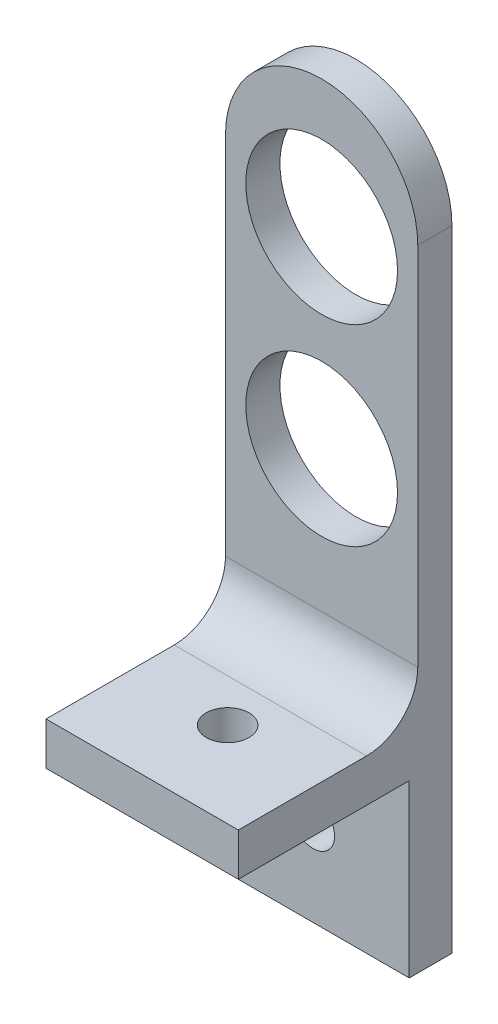
ISO-10303-21;
HEADER;
FILE_DESCRIPTION(('STEP AP214'),'2;1');
FILE_NAME('part.step','',(''),(''),'','','');
FILE_SCHEMA(('AUTOMOTIVE_DESIGN { 1 0 10303 214 1 1 1 1 }'));
ENDSEC;
DATA;
#1=APPLICATION_CONTEXT('core data for automotive mechanical design processes');
#2=APPLICATION_PROTOCOL_DEFINITION('international standard','automotive_design',2000,#1);
#3=PRODUCT_CONTEXT('',#1,'mechanical');
#4=PRODUCT('Part','Part','',(#3));
#5=PRODUCT_RELATED_PRODUCT_CATEGORY('part','',(#4));
#6=PRODUCT_DEFINITION_FORMATION('','',#4);
#7=PRODUCT_DEFINITION_CONTEXT('part definition',#1,'design');
#8=PRODUCT_DEFINITION('design','',#6,#7);
#9=PRODUCT_DEFINITION_SHAPE('','',#8);
#10=(LENGTH_UNIT() NAMED_UNIT(*) SI_UNIT(.MILLI.,.METRE.));
#11=(NAMED_UNIT(*) PLANE_ANGLE_UNIT() SI_UNIT($,.RADIAN.));
#12=(NAMED_UNIT(*) SI_UNIT($,.STERADIAN.) SOLID_ANGLE_UNIT());
#13=UNCERTAINTY_MEASURE_WITH_UNIT(LENGTH_MEASURE(1.E-05),#10,'distance_accuracy_value','');
#14=(GEOMETRIC_REPRESENTATION_CONTEXT(3) GLOBAL_UNCERTAINTY_ASSIGNED_CONTEXT((#13)) GLOBAL_UNIT_ASSIGNED_CONTEXT((#10,
#11,#12)) REPRESENTATION_CONTEXT('',''));
#15=CARTESIAN_POINT('',(0.,0.,0.));
#16=DIRECTION('',(0.,0.,1.));
#17=DIRECTION('',(1.,0.,0.));
#18=AXIS2_PLACEMENT_3D('',#15,#16,#17);
#19=CARTESIAN_POINT('',(0.,39.6875,5.08));
#20=DIRECTION('',(0.,0.,-1.));
#21=DIRECTION('',(-1.,0.,0.));
#22=AXIS2_PLACEMENT_3D('',#19,#20,#21);
#23=CYLINDRICAL_SURFACE('',#22,14.2875);
#24=DIRECTION('',(0.,0.,1.));
#25=VECTOR('',#24,1.);
#26=CARTESIAN_POINT('',(-14.2875,39.6875,5.08));
#27=LINE('',#26,#25);
#28=CARTESIAN_POINT('',(-14.2875,39.6875,5.08));
#29=VERTEX_POINT('',#28);
#30=CARTESIAN_POINT('',(-14.2875,39.6875,0.));
#31=VERTEX_POINT('',#30);
#32=EDGE_CURVE('E196',#29,#31,#27,.F.);
#33=ORIENTED_EDGE('',*,*,#32,.F.);
#34=CARTESIAN_POINT('',(0.,39.6875,5.08));
#35=DIRECTION('',(0.,0.,1.));
#36=DIRECTION('',(1.,0.,0.));
#37=AXIS2_PLACEMENT_3D('',#34,#35,#36);
#38=CIRCLE('',#37,14.2875);
#39=CARTESIAN_POINT('',(14.2875,39.6875,5.08));
#40=VERTEX_POINT('',#39);
#41=EDGE_CURVE('E57',#40,#29,#38,.T.);
#42=ORIENTED_EDGE('',*,*,#41,.F.);
#43=DIRECTION('',(0.,0.,-1.));
#44=VECTOR('',#43,1.);
#45=CARTESIAN_POINT('',(14.2875,39.6875,5.08));
#46=LINE('',#45,#44);
#47=CARTESIAN_POINT('',(14.2875,39.6875,0.));
#48=VERTEX_POINT('',#47);
#49=EDGE_CURVE('E205',#48,#40,#46,.F.);
#50=ORIENTED_EDGE('',*,*,#49,.F.);
#51=CARTESIAN_POINT('',(0.,39.6875,0.));
#52=DIRECTION('',(0.,0.,1.));
#53=DIRECTION('',(1.,0.,0.));
#54=AXIS2_PLACEMENT_3D('',#51,#52,#53);
#55=CIRCLE('',#54,14.2875);
#56=EDGE_CURVE('E11',#31,#48,#55,.F.);
#57=ORIENTED_EDGE('',*,*,#56,.F.);
#58=EDGE_LOOP('',(#33,#42,#50,#57));
#59=FACE_BOUND('',#58,.T.);
#60=ADVANCED_FACE('F50',(#59),#23,.T.);
#61=CARTESIAN_POINT('',(-14.2875,0.,5.08));
#62=DIRECTION('',(1.,0.,0.));
#63=DIRECTION('',(0.,1.,0.));
#64=AXIS2_PLACEMENT_3D('',#61,#62,#63);
#65=PLANE('',#64);
#66=DIRECTION('',(0.,-1.,0.));
#67=VECTOR('',#66,1.);
#68=CARTESIAN_POINT('',(-14.2875,0.,5.08));
#69=LINE('',#68,#67);
#70=CARTESIAN_POINT('',(-14.2875,-14.605,5.08));
#71=VERTEX_POINT('',#70);
#72=EDGE_CURVE('E167',#29,#71,#69,.T.);
#73=ORIENTED_EDGE('',*,*,#72,.F.);
#74=ORIENTED_EDGE('',*,*,#32,.T.);
#75=DIRECTION('',(0.,-1.,0.));
#76=VECTOR('',#75,1.);
#77=CARTESIAN_POINT('',(-14.2875,0.,0.));
#78=LINE('',#77,#76);
#79=CARTESIAN_POINT('',(-14.2875,-53.9749999999999,0.));
#80=VERTEX_POINT('',#79);
#81=EDGE_CURVE('E178',#31,#80,#78,.T.);
#82=ORIENTED_EDGE('',*,*,#81,.T.);
#83=DIRECTION('',(0.,0.,-1.));
#84=VECTOR('',#83,1.);
#85=CARTESIAN_POINT('',(-14.2875,-53.9749999999999,6.35));
#86=LINE('',#85,#84);
#87=CARTESIAN_POINT('',(-14.2875,-53.9749999999999,6.35));
#88=VERTEX_POINT('',#87);
#89=EDGE_CURVE('E127',#88,#80,#86,.T.);
#90=ORIENTED_EDGE('',*,*,#89,.F.);
#91=DIRECTION('',(0.,-1.,0.));
#92=VECTOR('',#91,1.);
#93=CARTESIAN_POINT('',(-14.2875,0.,6.35));
#94=LINE('',#93,#92);
#95=CARTESIAN_POINT('',(-14.2875,-28.575,6.35));
#96=VERTEX_POINT('',#95);
#97=EDGE_CURVE('E120',#96,#88,#94,.T.);
#98=ORIENTED_EDGE('',*,*,#97,.F.);
#99=DIRECTION('',(0.,0.,-1.));
#100=VECTOR('',#99,1.);
#101=CARTESIAN_POINT('',(-14.2875,-28.575,31.75));
#102=LINE('',#101,#100);
#103=CARTESIAN_POINT('',(-14.2875,-28.575,31.75));
#104=VERTEX_POINT('',#103);
#105=EDGE_CURVE('E125',#104,#96,#102,.T.);
#106=ORIENTED_EDGE('',*,*,#105,.F.);
#107=DIRECTION('',(0.,-1.,0.));
#108=VECTOR('',#107,1.);
#109=CARTESIAN_POINT('',(-14.2875,0.,31.75));
#110=LINE('',#109,#108);
#111=CARTESIAN_POINT('',(-14.2875,-22.225,31.75));
#112=VERTEX_POINT('',#111);
#113=EDGE_CURVE('E234',#112,#104,#110,.T.);
#114=ORIENTED_EDGE('',*,*,#113,.F.);
#115=DIRECTION('',(0.,0.,-1.));
#116=VECTOR('',#115,1.);
#117=CARTESIAN_POINT('',(-14.2875,-22.225,31.75));
#118=LINE('',#117,#116);
#119=CARTESIAN_POINT('',(-14.2875,-22.225,12.7));
#120=VERTEX_POINT('',#119);
#121=EDGE_CURVE('E144',#112,#120,#118,.T.);
#122=ORIENTED_EDGE('',*,*,#121,.T.);
#123=CARTESIAN_POINT('',(-14.2875,-14.605,12.7));
#124=DIRECTION('',(1.,0.,0.));
#125=DIRECTION('',(0.,1.,0.));
#126=AXIS2_PLACEMENT_3D('',#123,#124,#125);
#127=CIRCLE('',#126,7.62);
#128=EDGE_CURVE('E191',#120,#71,#127,.T.);
#129=ORIENTED_EDGE('',*,*,#128,.T.);
#130=EDGE_LOOP('',(#73,#74,#82,#90,#98,#106,#114,#122,#129));
#131=FACE_BOUND('',#130,.T.);
#132=ADVANCED_FACE('F119',(#131),#65,.F.);
#133=CARTESIAN_POINT('',(14.2875,0.,5.08));
#134=DIRECTION('',(1.,0.,0.));
#135=DIRECTION('',(0.,1.,0.));
#136=AXIS2_PLACEMENT_3D('',#133,#134,#135);
#137=PLANE('',#136);
#138=DIRECTION('',(0.,-1.,0.));
#139=VECTOR('',#138,1.);
#140=CARTESIAN_POINT('',(14.2875,0.,0.));
#141=LINE('',#140,#139);
#142=CARTESIAN_POINT('',(14.2875,-53.9749999999999,0.));
#143=VERTEX_POINT('',#142);
#144=EDGE_CURVE('E165',#48,#143,#141,.T.);
#145=ORIENTED_EDGE('',*,*,#144,.F.);
#146=ORIENTED_EDGE('',*,*,#49,.T.);
#147=DIRECTION('',(0.,-1.,0.));
#148=VECTOR('',#147,1.);
#149=CARTESIAN_POINT('',(14.2875,0.,5.08));
#150=LINE('',#149,#148);
#151=CARTESIAN_POINT('',(14.2875,-14.605,5.08));
#152=VERTEX_POINT('',#151);
#153=EDGE_CURVE('E166',#40,#152,#150,.T.);
#154=ORIENTED_EDGE('',*,*,#153,.T.);
#155=CARTESIAN_POINT('',(14.2875,-14.605,12.7));
#156=DIRECTION('',(1.,0.,0.));
#157=DIRECTION('',(0.,1.,0.));
#158=AXIS2_PLACEMENT_3D('',#155,#156,#157);
#159=CIRCLE('',#158,7.62);
#160=CARTESIAN_POINT('',(14.2875,-22.225,12.7));
#161=VERTEX_POINT('',#160);
#162=EDGE_CURVE('E192',#152,#161,#159,.F.);
#163=ORIENTED_EDGE('',*,*,#162,.T.);
#164=DIRECTION('',(0.,0.,-1.));
#165=VECTOR('',#164,1.);
#166=CARTESIAN_POINT('',(14.2875,-22.225,31.75));
#167=LINE('',#166,#165);
#168=CARTESIAN_POINT('',(14.2875,-22.225,31.75));
#169=VERTEX_POINT('',#168);
#170=EDGE_CURVE('E153',#169,#161,#167,.T.);
#171=ORIENTED_EDGE('',*,*,#170,.F.);
#172=DIRECTION('',(0.,-1.,0.));
#173=VECTOR('',#172,1.);
#174=CARTESIAN_POINT('',(14.2875,0.,31.75));
#175=LINE('',#174,#173);
#176=CARTESIAN_POINT('',(14.2875,-28.575,31.75));
#177=VERTEX_POINT('',#176);
#178=EDGE_CURVE('E226',#169,#177,#175,.T.);
#179=ORIENTED_EDGE('',*,*,#178,.T.);
#180=DIRECTION('',(0.,0.,-1.));
#181=VECTOR('',#180,1.);
#182=CARTESIAN_POINT('',(14.2875,-28.575,31.75));
#183=LINE('',#182,#181);
#184=CARTESIAN_POINT('',(14.2875,-28.575,6.35));
#185=VERTEX_POINT('',#184);
#186=EDGE_CURVE('E148',#177,#185,#183,.T.);
#187=ORIENTED_EDGE('',*,*,#186,.T.);
#188=DIRECTION('',(0.,-1.,0.));
#189=VECTOR('',#188,1.);
#190=CARTESIAN_POINT('',(14.2875,0.,6.35));
#191=LINE('',#190,#189);
#192=CARTESIAN_POINT('',(14.2875,-53.9749999999999,6.35));
#193=VERTEX_POINT('',#192);
#194=EDGE_CURVE('E134',#185,#193,#191,.T.);
#195=ORIENTED_EDGE('',*,*,#194,.T.);
#196=DIRECTION('',(0.,0.,-1.));
#197=VECTOR('',#196,1.);
#198=CARTESIAN_POINT('',(14.2875,-53.9749999999999,6.35));
#199=LINE('',#198,#197);
#200=EDGE_CURVE('E239',#193,#143,#199,.T.);
#201=ORIENTED_EDGE('',*,*,#200,.T.);
#202=EDGE_LOOP('',(#145,#146,#154,#163,#171,#179,#187,#195,#201));
#203=FACE_BOUND('',#202,.T.);
#204=ADVANCED_FACE('F220',(#203),#137,.T.);
#205=CARTESIAN_POINT('',(0.,6.34999999999999,5.08));
#206=DIRECTION('',(0.,0.,-1.));
#207=DIRECTION('',(-1.,0.,0.));
#208=AXIS2_PLACEMENT_3D('',#205,#206,#207);
#209=CYLINDRICAL_SURFACE('',#208,11.2776);
#210=CARTESIAN_POINT('',(0.,6.34999999999999,5.08));
#211=DIRECTION('',(0.,0.,1.));
#212=DIRECTION('',(1.,0.,0.));
#213=AXIS2_PLACEMENT_3D('',#210,#211,#212);
#214=CIRCLE('',#213,11.2776);
#215=CARTESIAN_POINT('',(11.2776,6.34999999999999,5.08));
#216=VERTEX_POINT('',#215);
#217=EDGE_CURVE('E161',#216,#216,#214,.T.);
#218=ORIENTED_EDGE('',*,*,#217,.T.);
#219=EDGE_LOOP('',(#218));
#220=FACE_BOUND('',#219,.T.);
#221=CARTESIAN_POINT('',(0.,6.34999999999999,0.));
#222=DIRECTION('',(0.,0.,1.));
#223=DIRECTION('',(1.,0.,0.));
#224=AXIS2_PLACEMENT_3D('',#221,#222,#223);
#225=CIRCLE('',#224,11.2776);
#226=CARTESIAN_POINT('',(11.2776,6.34999999999999,0.));
#227=VERTEX_POINT('',#226);
#228=EDGE_CURVE('E177',#227,#227,#225,.T.);
#229=ORIENTED_EDGE('',*,*,#228,.F.);
#230=EDGE_LOOP('',(#229));
#231=FACE_BOUND('',#230,.T.);
#232=ADVANCED_FACE('F295',(#220,#231),#209,.F.);
#233=CARTESIAN_POINT('',(0.,34.925,5.08));
#234=DIRECTION('',(0.,0.,-1.));
#235=DIRECTION('',(-1.,0.,0.));
#236=AXIS2_PLACEMENT_3D('',#233,#234,#235);
#237=CYLINDRICAL_SURFACE('',#236,11.2776);
#238=CARTESIAN_POINT('',(0.,34.925,5.08));
#239=DIRECTION('',(0.,0.,1.));
#240=DIRECTION('',(1.,0.,0.));
#241=AXIS2_PLACEMENT_3D('',#238,#239,#240);
#242=CIRCLE('',#241,11.2776);
#243=CARTESIAN_POINT('',(11.2776,34.925,5.08));
#244=VERTEX_POINT('',#243);
#245=EDGE_CURVE('E160',#244,#244,#242,.T.);
#246=ORIENTED_EDGE('',*,*,#245,.T.);
#247=EDGE_LOOP('',(#246));
#248=FACE_BOUND('',#247,.T.);
#249=CARTESIAN_POINT('',(0.,34.925,0.));
#250=DIRECTION('',(0.,0.,1.));
#251=DIRECTION('',(1.,0.,0.));
#252=AXIS2_PLACEMENT_3D('',#249,#250,#251);
#253=CIRCLE('',#252,11.2776);
#254=CARTESIAN_POINT('',(11.2776,34.925,0.));
#255=VERTEX_POINT('',#254);
#256=EDGE_CURVE('E151',#255,#255,#253,.T.);
#257=ORIENTED_EDGE('',*,*,#256,.F.);
#258=EDGE_LOOP('',(#257));
#259=FACE_BOUND('',#258,.T.);
#260=ADVANCED_FACE('F297',(#248,#259),#237,.F.);
#261=CARTESIAN_POINT('',(0.,0.,5.08));
#262=DIRECTION('',(0.,0.,1.));
#263=DIRECTION('',(1.,0.,0.));
#264=AXIS2_PLACEMENT_3D('',#261,#262,#263);
#265=PLANE('',#264);
#266=ORIENTED_EDGE('',*,*,#245,.F.);
#267=EDGE_LOOP('',(#266));
#268=FACE_BOUND('',#267,.T.);
#269=ORIENTED_EDGE('',*,*,#217,.F.);
#270=EDGE_LOOP('',(#269));
#271=FACE_BOUND('',#270,.T.);
#272=ORIENTED_EDGE('',*,*,#153,.F.);
#273=ORIENTED_EDGE('',*,*,#41,.T.);
#274=ORIENTED_EDGE('',*,*,#72,.T.);
#275=DIRECTION('',(1.,0.,0.));
#276=VECTOR('',#275,1.);
#277=CARTESIAN_POINT('',(14.2875,-14.605,5.08));
#278=LINE('',#277,#276);
#279=EDGE_CURVE('E175',#71,#152,#278,.T.);
#280=ORIENTED_EDGE('',*,*,#279,.T.);
#281=EDGE_LOOP('',(#272,#273,#274,#280));
#282=FACE_BOUND('',#281,.T.);
#283=ADVANCED_FACE('F210',(#268,#271,#282),#265,.T.);
#284=CARTESIAN_POINT('',(0.,0.,0.));
#285=DIRECTION('',(0.,0.,1.));
#286=DIRECTION('',(1.,0.,0.));
#287=AXIS2_PLACEMENT_3D('',#284,#285,#286);
#288=PLANE('',#287);
#289=ORIENTED_EDGE('',*,*,#256,.T.);
#290=EDGE_LOOP('',(#289));
#291=FACE_BOUND('',#290,.T.);
#292=ORIENTED_EDGE('',*,*,#228,.T.);
#293=EDGE_LOOP('',(#292));
#294=FACE_BOUND('',#293,.T.);
#295=ORIENTED_EDGE('',*,*,#81,.F.);
#296=ORIENTED_EDGE('',*,*,#56,.T.);
#297=ORIENTED_EDGE('',*,*,#144,.T.);
#298=DIRECTION('',(1.,0.,0.));
#299=VECTOR('',#298,1.);
#300=CARTESIAN_POINT('',(0.,-53.9749999999999,0.));
#301=LINE('',#300,#299);
#302=EDGE_CURVE('E242',#80,#143,#301,.T.);
#303=ORIENTED_EDGE('',*,*,#302,.F.);
#304=EDGE_LOOP('',(#295,#296,#297,#303));
#305=FACE_BOUND('',#304,.T.);
#306=CARTESIAN_POINT('',(0.,-41.275,0.));
#307=DIRECTION('',(0.,0.,1.));
#308=DIRECTION('',(1.,0.,0.));
#309=AXIS2_PLACEMENT_3D('',#306,#307,#308);
#310=CIRCLE('',#309,3.1877);
#311=CARTESIAN_POINT('',(3.1877,-41.275,0.));
#312=VERTEX_POINT('',#311);
#313=EDGE_CURVE('E249',#312,#312,#310,.T.);
#314=ORIENTED_EDGE('',*,*,#313,.T.);
#315=EDGE_LOOP('',(#314));
#316=FACE_BOUND('',#315,.T.);
#317=ADVANCED_FACE('F278',(#291,#294,#305,#316),#288,.F.);
#318=CARTESIAN_POINT('',(0.,-22.225,31.75));
#319=DIRECTION('',(0.,1.,0.));
#320=DIRECTION('',(0.,0.,1.));
#321=AXIS2_PLACEMENT_3D('',#318,#319,#320);
#322=PLANE('',#321);
#323=CARTESIAN_POINT('',(0.,-22.225,19.05));
#324=DIRECTION('',(0.,1.,0.));
#325=DIRECTION('',(0.,0.,1.));
#326=AXIS2_PLACEMENT_3D('',#323,#324,#325);
#327=CIRCLE('',#326,3.1877);
#328=CARTESIAN_POINT('',(0.,-22.225,22.2377));
#329=VERTEX_POINT('',#328);
#330=EDGE_CURVE('E253',#329,#329,#327,.T.);
#331=ORIENTED_EDGE('',*,*,#330,.F.);
#332=EDGE_LOOP('',(#331));
#333=FACE_BOUND('',#332,.T.);
#334=ORIENTED_EDGE('',*,*,#170,.T.);
#335=DIRECTION('',(1.,0.,0.));
#336=VECTOR('',#335,1.);
#337=CARTESIAN_POINT('',(-14.2875,-22.225,12.7));
#338=LINE('',#337,#336);
#339=EDGE_CURVE('E187',#161,#120,#338,.F.);
#340=ORIENTED_EDGE('',*,*,#339,.T.);
#341=ORIENTED_EDGE('',*,*,#121,.F.);
#342=DIRECTION('',(1.,0.,0.));
#343=VECTOR('',#342,1.);
#344=CARTESIAN_POINT('',(0.,-22.225,31.75));
#345=LINE('',#344,#343);
#346=EDGE_CURVE('E224',#112,#169,#345,.T.);
#347=ORIENTED_EDGE('',*,*,#346,.T.);
#348=EDGE_LOOP('',(#334,#340,#341,#347));
#349=FACE_BOUND('',#348,.T.);
#350=ADVANCED_FACE('F222',(#333,#349),#322,.T.);
#351=CARTESIAN_POINT('',(0.,-28.575,31.75));
#352=DIRECTION('',(0.,1.,0.));
#353=DIRECTION('',(0.,0.,1.));
#354=AXIS2_PLACEMENT_3D('',#351,#352,#353);
#355=PLANE('',#354);
#356=CARTESIAN_POINT('',(0.,-28.575,19.05));
#357=DIRECTION('',(0.,-1.,0.));
#358=DIRECTION('',(0.,0.,-1.));
#359=AXIS2_PLACEMENT_3D('',#356,#357,#358);
#360=CIRCLE('',#359,3.1877);
#361=CARTESIAN_POINT('',(0.,-28.575,15.8623));
#362=VERTEX_POINT('',#361);
#363=EDGE_CURVE('E265',#362,#362,#360,.T.);
#364=ORIENTED_EDGE('',*,*,#363,.F.);
#365=EDGE_LOOP('',(#364));
#366=FACE_BOUND('',#365,.T.);
#367=ORIENTED_EDGE('',*,*,#105,.T.);
#368=DIRECTION('',(1.,0.,0.));
#369=VECTOR('',#368,1.);
#370=CARTESIAN_POINT('',(0.,-28.575,6.35));
#371=LINE('',#370,#369);
#372=EDGE_CURVE('E128',#96,#185,#371,.T.);
#373=ORIENTED_EDGE('',*,*,#372,.T.);
#374=ORIENTED_EDGE('',*,*,#186,.F.);
#375=DIRECTION('',(1.,0.,0.));
#376=VECTOR('',#375,1.);
#377=CARTESIAN_POINT('',(0.,-28.575,31.75));
#378=LINE('',#377,#376);
#379=EDGE_CURVE('E141',#104,#177,#378,.T.);
#380=ORIENTED_EDGE('',*,*,#379,.F.);
#381=EDGE_LOOP('',(#367,#373,#374,#380));
#382=FACE_BOUND('',#381,.T.);
#383=ADVANCED_FACE('F142',(#366,#382),#355,.F.);
#384=CARTESIAN_POINT('',(0.,0.,31.75));
#385=DIRECTION('',(0.,0.,1.));
#386=DIRECTION('',(1.,0.,0.));
#387=AXIS2_PLACEMENT_3D('',#384,#385,#386);
#388=PLANE('',#387);
#389=ORIENTED_EDGE('',*,*,#346,.F.);
#390=ORIENTED_EDGE('',*,*,#113,.T.);
#391=ORIENTED_EDGE('',*,*,#379,.T.);
#392=ORIENTED_EDGE('',*,*,#178,.F.);
#393=EDGE_LOOP('',(#389,#390,#391,#392));
#394=FACE_BOUND('',#393,.T.);
#395=ADVANCED_FACE('F269',(#394),#388,.T.);
#396=CARTESIAN_POINT('',(0.,-53.9749999999999,6.35));
#397=DIRECTION('',(0.,1.,0.));
#398=DIRECTION('',(0.,0.,1.));
#399=AXIS2_PLACEMENT_3D('',#396,#397,#398);
#400=PLANE('',#399);
#401=ORIENTED_EDGE('',*,*,#302,.T.);
#402=ORIENTED_EDGE('',*,*,#200,.F.);
#403=DIRECTION('',(1.,0.,0.));
#404=VECTOR('',#403,1.);
#405=CARTESIAN_POINT('',(0.,-53.9749999999999,6.35));
#406=LINE('',#405,#404);
#407=EDGE_CURVE('E129',#88,#193,#406,.T.);
#408=ORIENTED_EDGE('',*,*,#407,.F.);
#409=ORIENTED_EDGE('',*,*,#89,.T.);
#410=EDGE_LOOP('',(#401,#402,#408,#409));
#411=FACE_BOUND('',#410,.T.);
#412=ADVANCED_FACE('F280',(#411),#400,.F.);
#413=CARTESIAN_POINT('',(0.,-41.275,6.35));
#414=DIRECTION('',(0.,0.,-1.));
#415=DIRECTION('',(-1.,0.,0.));
#416=AXIS2_PLACEMENT_3D('',#413,#414,#415);
#417=CYLINDRICAL_SURFACE('',#416,3.1877);
#418=CARTESIAN_POINT('',(0.,-41.275,6.35));
#419=DIRECTION('',(0.,0.,1.));
#420=DIRECTION('',(1.,0.,0.));
#421=AXIS2_PLACEMENT_3D('',#418,#419,#420);
#422=CIRCLE('',#421,3.1877);
#423=CARTESIAN_POINT('',(3.1877,-41.275,6.35));
#424=VERTEX_POINT('',#423);
#425=EDGE_CURVE('E138',#424,#424,#422,.T.);
#426=ORIENTED_EDGE('',*,*,#425,.T.);
#427=EDGE_LOOP('',(#426));
#428=FACE_BOUND('',#427,.T.);
#429=ORIENTED_EDGE('',*,*,#313,.F.);
#430=EDGE_LOOP('',(#429));
#431=FACE_BOUND('',#430,.T.);
#432=ADVANCED_FACE('F307',(#428,#431),#417,.F.);
#433=CARTESIAN_POINT('',(0.,0.,6.35));
#434=DIRECTION('',(0.,0.,1.));
#435=DIRECTION('',(1.,0.,0.));
#436=AXIS2_PLACEMENT_3D('',#433,#434,#435);
#437=PLANE('',#436);
#438=ORIENTED_EDGE('',*,*,#425,.F.);
#439=EDGE_LOOP('',(#438));
#440=FACE_BOUND('',#439,.T.);
#441=ORIENTED_EDGE('',*,*,#372,.F.);
#442=ORIENTED_EDGE('',*,*,#97,.T.);
#443=ORIENTED_EDGE('',*,*,#407,.T.);
#444=ORIENTED_EDGE('',*,*,#194,.F.);
#445=EDGE_LOOP('',(#441,#442,#443,#444));
#446=FACE_BOUND('',#445,.T.);
#447=ADVANCED_FACE('F132',(#440,#446),#437,.T.);
#448=CARTESIAN_POINT('',(0.,-14.605,12.7));
#449=DIRECTION('',(-1.,0.,0.));
#450=DIRECTION('',(0.,0.,1.));
#451=AXIS2_PLACEMENT_3D('',#448,#449,#450);
#452=CYLINDRICAL_SURFACE('',#451,7.62);
#453=ORIENTED_EDGE('',*,*,#128,.F.);
#454=ORIENTED_EDGE('',*,*,#339,.F.);
#455=ORIENTED_EDGE('',*,*,#162,.F.);
#456=ORIENTED_EDGE('',*,*,#279,.F.);
#457=EDGE_LOOP('',(#453,#454,#455,#456));
#458=FACE_BOUND('',#457,.T.);
#459=ADVANCED_FACE('F213',(#458),#452,.F.);
#460=CARTESIAN_POINT('',(0.,53.975,19.05));
#461=DIRECTION('',(0.,-1.,0.));
#462=DIRECTION('',(0.,0.,-1.));
#463=AXIS2_PLACEMENT_3D('',#460,#461,#462);
#464=CYLINDRICAL_SURFACE('',#463,3.1877);
#465=ORIENTED_EDGE('',*,*,#330,.T.);
#466=EDGE_LOOP('',(#465));
#467=FACE_BOUND('',#466,.T.);
#468=ORIENTED_EDGE('',*,*,#363,.T.);
#469=EDGE_LOOP('',(#468));
#470=FACE_BOUND('',#469,.T.);
#471=ADVANCED_FACE('F270',(#467,#470),#464,.F.);
#472=CLOSED_SHELL('',(#60,#132,#204,#232,#260,#283,#317,#350,#383,#395,#412,#432,#447,#459,#471));
#473=MANIFOLD_SOLID_BREP('B2',#472);
#474=ADVANCED_BREP_SHAPE_REPRESENTATION('',(#18,#473),#14);
#475=SHAPE_DEFINITION_REPRESENTATION(#9,#474);
ENDSEC;
END-ISO-10303-21;
